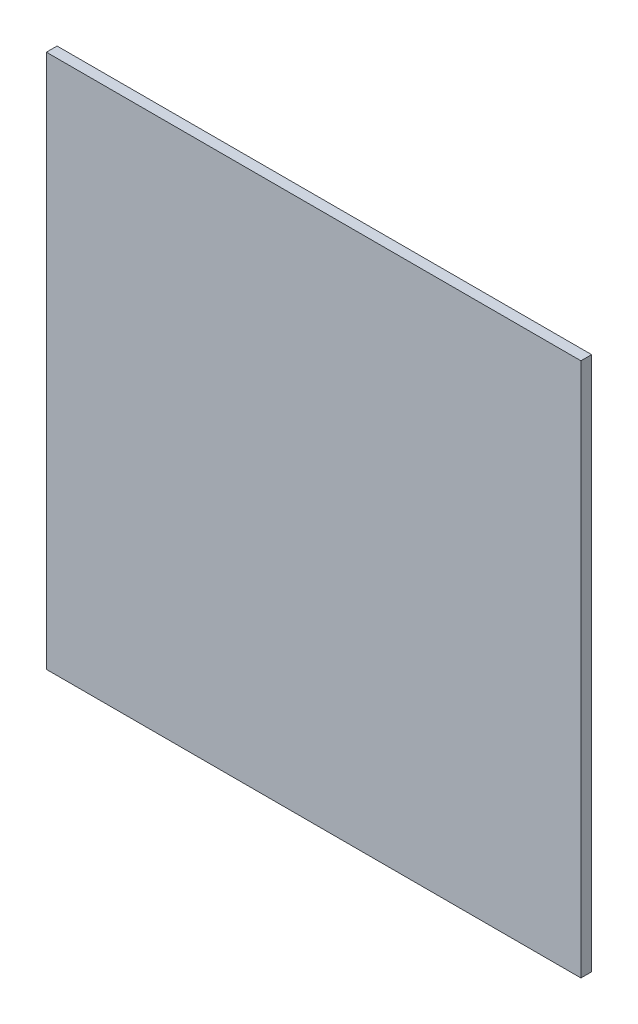
ISO-10303-21;
HEADER;
FILE_DESCRIPTION(('STEP AP214'),'2;1');
FILE_NAME('part.step','',(''),(''),'','','');
FILE_SCHEMA(('AUTOMOTIVE_DESIGN { 1 0 10303 214 1 1 1 1 }'));
ENDSEC;
DATA;
#1=APPLICATION_CONTEXT('core data for automotive mechanical design processes');
#2=APPLICATION_PROTOCOL_DEFINITION('international standard','automotive_design',2000,#1);
#3=PRODUCT_CONTEXT('',#1,'mechanical');
#4=PRODUCT('Part','Part','',(#3));
#5=PRODUCT_RELATED_PRODUCT_CATEGORY('part','',(#4));
#6=PRODUCT_DEFINITION_FORMATION('','',#4);
#7=PRODUCT_DEFINITION_CONTEXT('part definition',#1,'design');
#8=PRODUCT_DEFINITION('design','',#6,#7);
#9=PRODUCT_DEFINITION_SHAPE('','',#8);
#10=(LENGTH_UNIT() NAMED_UNIT(*) SI_UNIT(.MILLI.,.METRE.));
#11=(NAMED_UNIT(*) PLANE_ANGLE_UNIT() SI_UNIT($,.RADIAN.));
#12=(NAMED_UNIT(*) SI_UNIT($,.STERADIAN.) SOLID_ANGLE_UNIT());
#13=UNCERTAINTY_MEASURE_WITH_UNIT(LENGTH_MEASURE(1.E-05),#10,'distance_accuracy_value','');
#14=(GEOMETRIC_REPRESENTATION_CONTEXT(3) GLOBAL_UNCERTAINTY_ASSIGNED_CONTEXT((#13)) GLOBAL_UNIT_ASSIGNED_CONTEXT((#10,
#11,#12)) REPRESENTATION_CONTEXT('',''));
#15=CARTESIAN_POINT('',(0.,0.,0.));
#16=DIRECTION('',(0.,0.,1.));
#17=DIRECTION('',(1.,0.,0.));
#18=AXIS2_PLACEMENT_3D('',#15,#16,#17);
#19=CARTESIAN_POINT('',(-50.,-50.,2.));
#20=DIRECTION('',(1.,0.,0.));
#21=DIRECTION('',(0.,0.,-1.));
#22=AXIS2_PLACEMENT_3D('',#19,#20,#21);
#23=PLANE('',#22);
#24=DIRECTION('',(0.,-1.,0.));
#25=VECTOR('',#24,1.);
#26=CARTESIAN_POINT('',(-50.,-50.,0.));
#27=LINE('',#26,#25);
#28=CARTESIAN_POINT('',(-50.,50.,0.));
#29=VERTEX_POINT('',#28);
#30=CARTESIAN_POINT('',(-50.,-50.,0.));
#31=VERTEX_POINT('',#30);
#32=EDGE_CURVE('E96',#29,#31,#27,.T.);
#33=ORIENTED_EDGE('',*,*,#32,.T.);
#34=DIRECTION('',(0.,0.,-1.));
#35=VECTOR('',#34,1.);
#36=CARTESIAN_POINT('',(-50.,-50.,2.));
#37=LINE('',#36,#35);
#38=CARTESIAN_POINT('',(-50.,-50.,2.));
#39=VERTEX_POINT('',#38);
#40=EDGE_CURVE('E11',#39,#31,#37,.T.);
#41=ORIENTED_EDGE('',*,*,#40,.F.);
#42=DIRECTION('',(0.,-1.,0.));
#43=VECTOR('',#42,1.);
#44=CARTESIAN_POINT('',(-50.,-50.,2.));
#45=LINE('',#44,#43);
#46=CARTESIAN_POINT('',(-50.,50.,2.));
#47=VERTEX_POINT('',#46);
#48=EDGE_CURVE('E84',#47,#39,#45,.T.);
#49=ORIENTED_EDGE('',*,*,#48,.F.);
#50=DIRECTION('',(0.,0.,-1.));
#51=VECTOR('',#50,1.);
#52=CARTESIAN_POINT('',(-50.,50.,2.));
#53=LINE('',#52,#51);
#54=EDGE_CURVE('E92',#47,#29,#53,.T.);
#55=ORIENTED_EDGE('',*,*,#54,.T.);
#56=EDGE_LOOP('',(#33,#41,#49,#55));
#57=FACE_BOUND('',#56,.T.);
#58=ADVANCED_FACE('F33',(#57),#23,.F.);
#59=CARTESIAN_POINT('',(50.,-50.,2.));
#60=DIRECTION('',(0.,1.,0.));
#61=DIRECTION('',(-1.,0.,0.));
#62=AXIS2_PLACEMENT_3D('',#59,#60,#61);
#63=PLANE('',#62);
#64=DIRECTION('',(1.,0.,0.));
#65=VECTOR('',#64,1.);
#66=CARTESIAN_POINT('',(50.,-50.,0.));
#67=LINE('',#66,#65);
#68=CARTESIAN_POINT('',(50.,-50.,0.));
#69=VERTEX_POINT('',#68);
#70=EDGE_CURVE('E88',#31,#69,#67,.T.);
#71=ORIENTED_EDGE('',*,*,#70,.T.);
#72=DIRECTION('',(0.,0.,-1.));
#73=VECTOR('',#72,1.);
#74=CARTESIAN_POINT('',(50.,-50.,2.));
#75=LINE('',#74,#73);
#76=CARTESIAN_POINT('',(50.,-50.,2.));
#77=VERTEX_POINT('',#76);
#78=EDGE_CURVE('E41',#77,#69,#75,.T.);
#79=ORIENTED_EDGE('',*,*,#78,.F.);
#80=DIRECTION('',(1.,0.,0.));
#81=VECTOR('',#80,1.);
#82=CARTESIAN_POINT('',(50.,-50.,2.));
#83=LINE('',#82,#81);
#84=EDGE_CURVE('E79',#39,#77,#83,.T.);
#85=ORIENTED_EDGE('',*,*,#84,.F.);
#86=ORIENTED_EDGE('',*,*,#40,.T.);
#87=EDGE_LOOP('',(#71,#79,#85,#86));
#88=FACE_BOUND('',#87,.T.);
#89=ADVANCED_FACE('F87',(#88),#63,.F.);
#90=CARTESIAN_POINT('',(50.,-50.,2.));
#91=DIRECTION('',(-1.,0.,0.));
#92=DIRECTION('',(0.,0.,1.));
#93=AXIS2_PLACEMENT_3D('',#90,#91,#92);
#94=PLANE('',#93);
#95=DIRECTION('',(0.,1.,0.));
#96=VECTOR('',#95,1.);
#97=CARTESIAN_POINT('',(50.,-50.,0.));
#98=LINE('',#97,#96);
#99=CARTESIAN_POINT('',(50.,50.,0.));
#100=VERTEX_POINT('',#99);
#101=EDGE_CURVE('E66',#69,#100,#98,.T.);
#102=ORIENTED_EDGE('',*,*,#101,.T.);
#103=DIRECTION('',(0.,0.,-1.));
#104=VECTOR('',#103,1.);
#105=CARTESIAN_POINT('',(50.,50.,2.));
#106=LINE('',#105,#104);
#107=CARTESIAN_POINT('',(50.,50.,2.));
#108=VERTEX_POINT('',#107);
#109=EDGE_CURVE('E89',#108,#100,#106,.T.);
#110=ORIENTED_EDGE('',*,*,#109,.F.);
#111=DIRECTION('',(0.,1.,0.));
#112=VECTOR('',#111,1.);
#113=CARTESIAN_POINT('',(50.,-50.,2.));
#114=LINE('',#113,#112);
#115=EDGE_CURVE('E82',#77,#108,#114,.T.);
#116=ORIENTED_EDGE('',*,*,#115,.F.);
#117=ORIENTED_EDGE('',*,*,#78,.T.);
#118=EDGE_LOOP('',(#102,#110,#116,#117));
#119=FACE_BOUND('',#118,.T.);
#120=ADVANCED_FACE('F90',(#119),#94,.F.);
#121=CARTESIAN_POINT('',(50.,50.,2.));
#122=DIRECTION('',(0.,-1.,0.));
#123=DIRECTION('',(1.,0.,0.));
#124=AXIS2_PLACEMENT_3D('',#121,#122,#123);
#125=PLANE('',#124);
#126=DIRECTION('',(-1.,0.,0.));
#127=VECTOR('',#126,1.);
#128=CARTESIAN_POINT('',(50.,50.,0.));
#129=LINE('',#128,#127);
#130=EDGE_CURVE('E72',#100,#29,#129,.T.);
#131=ORIENTED_EDGE('',*,*,#130,.T.);
#132=ORIENTED_EDGE('',*,*,#54,.F.);
#133=DIRECTION('',(-1.,0.,0.));
#134=VECTOR('',#133,1.);
#135=CARTESIAN_POINT('',(50.,50.,2.));
#136=LINE('',#135,#134);
#137=EDGE_CURVE('E49',#108,#47,#136,.T.);
#138=ORIENTED_EDGE('',*,*,#137,.F.);
#139=ORIENTED_EDGE('',*,*,#109,.T.);
#140=EDGE_LOOP('',(#131,#132,#138,#139));
#141=FACE_BOUND('',#140,.T.);
#142=ADVANCED_FACE('F103',(#141),#125,.F.);
#143=CARTESIAN_POINT('',(0.,0.,2.));
#144=DIRECTION('',(0.,0.,1.));
#145=DIRECTION('',(1.,0.,0.));
#146=AXIS2_PLACEMENT_3D('',#143,#144,#145);
#147=PLANE('',#146);
#148=ORIENTED_EDGE('',*,*,#48,.T.);
#149=ORIENTED_EDGE('',*,*,#84,.T.);
#150=ORIENTED_EDGE('',*,*,#115,.T.);
#151=ORIENTED_EDGE('',*,*,#137,.T.);
#152=EDGE_LOOP('',(#148,#149,#150,#151));
#153=FACE_BOUND('',#152,.T.);
#154=ADVANCED_FACE('F80',(#153),#147,.T.);
#155=CARTESIAN_POINT('',(0.,0.,0.));
#156=DIRECTION('',(0.,0.,1.));
#157=DIRECTION('',(1.,0.,0.));
#158=AXIS2_PLACEMENT_3D('',#155,#156,#157);
#159=PLANE('',#158);
#160=ORIENTED_EDGE('',*,*,#32,.F.);
#161=ORIENTED_EDGE('',*,*,#130,.F.);
#162=ORIENTED_EDGE('',*,*,#101,.F.);
#163=ORIENTED_EDGE('',*,*,#70,.F.);
#164=EDGE_LOOP('',(#160,#161,#162,#163));
#165=FACE_BOUND('',#164,.T.);
#166=ADVANCED_FACE('F106',(#165),#159,.F.);
#167=CLOSED_SHELL('',(#58,#89,#120,#142,#154,#166));
#168=MANIFOLD_SOLID_BREP('B2',#167);
#169=ADVANCED_BREP_SHAPE_REPRESENTATION('',(#18,#168),#14);
#170=SHAPE_DEFINITION_REPRESENTATION(#9,#169);
ENDSEC;
END-ISO-10303-21;
